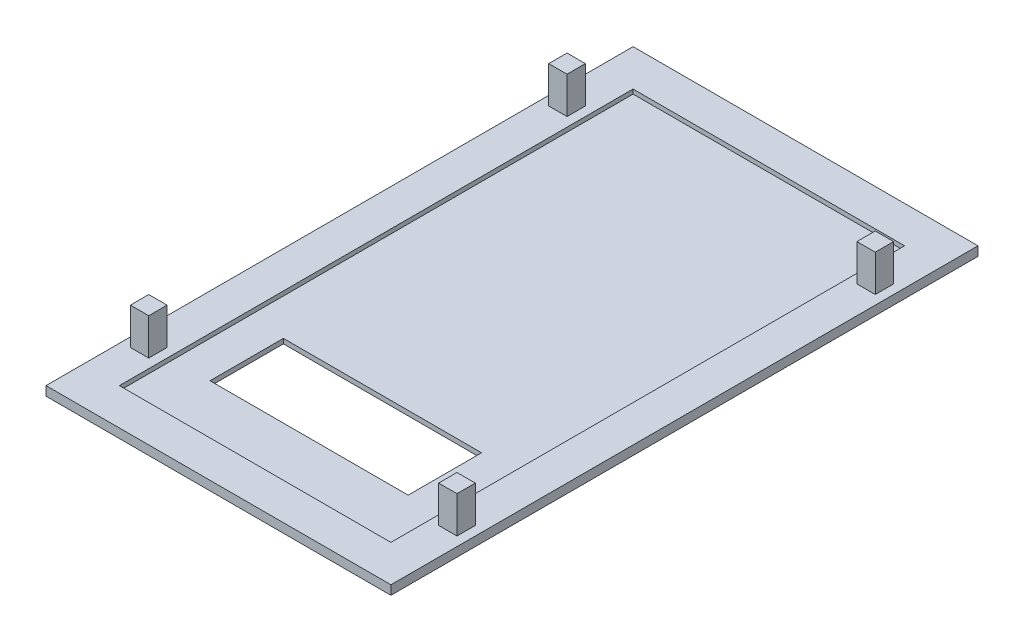
ISO-10303-21;
HEADER;
FILE_DESCRIPTION(('STEP AP214'),'2;1');
FILE_NAME('part.step','',(''),(''),'','','');
FILE_SCHEMA(('AUTOMOTIVE_DESIGN { 1 0 10303 214 1 1 1 1 }'));
ENDSEC;
DATA;
#1=APPLICATION_CONTEXT('core data for automotive mechanical design processes');
#2=APPLICATION_PROTOCOL_DEFINITION('international standard','automotive_design',2000,#1);
#3=PRODUCT_CONTEXT('',#1,'mechanical');
#4=PRODUCT('Part','Part','',(#3));
#5=PRODUCT_RELATED_PRODUCT_CATEGORY('part','',(#4));
#6=PRODUCT_DEFINITION_FORMATION('','',#4);
#7=PRODUCT_DEFINITION_CONTEXT('part definition',#1,'design');
#8=PRODUCT_DEFINITION('design','',#6,#7);
#9=PRODUCT_DEFINITION_SHAPE('','',#8);
#10=(LENGTH_UNIT() NAMED_UNIT(*) SI_UNIT(.MILLI.,.METRE.));
#11=(NAMED_UNIT(*) PLANE_ANGLE_UNIT() SI_UNIT($,.RADIAN.));
#12=(NAMED_UNIT(*) SI_UNIT($,.STERADIAN.) SOLID_ANGLE_UNIT());
#13=UNCERTAINTY_MEASURE_WITH_UNIT(LENGTH_MEASURE(1.E-05),#10,'distance_accuracy_value','');
#14=(GEOMETRIC_REPRESENTATION_CONTEXT(3) GLOBAL_UNCERTAINTY_ASSIGNED_CONTEXT((#13)) GLOBAL_UNIT_ASSIGNED_CONTEXT((#10,
#11,#12)) REPRESENTATION_CONTEXT('',''));
#15=CARTESIAN_POINT('',(0.,0.,0.));
#16=DIRECTION('',(0.,0.,1.));
#17=DIRECTION('',(1.,0.,0.));
#18=AXIS2_PLACEMENT_3D('',#15,#16,#17);
#19=CARTESIAN_POINT('',(10.,-3.75,-22.35));
#20=DIRECTION('',(-1.,0.,0.));
#21=DIRECTION('',(0.,0.,1.));
#22=AXIS2_PLACEMENT_3D('',#19,#20,#21);
#23=PLANE('',#22);
#24=DIRECTION('',(0.,0.,-1.));
#25=VECTOR('',#24,1.);
#26=CARTESIAN_POINT('',(10.,0.65,-22.35));
#27=LINE('',#26,#25);
#28=CARTESIAN_POINT('',(10.,0.65,-12.35));
#29=VERTEX_POINT('',#28);
#30=CARTESIAN_POINT('',(10.,0.65,-22.35));
#31=VERTEX_POINT('',#30);
#32=EDGE_CURVE('E258',#29,#31,#27,.T.);
#33=ORIENTED_EDGE('',*,*,#32,.F.);
#34=DIRECTION('',(0.,1.,0.));
#35=VECTOR('',#34,1.);
#36=CARTESIAN_POINT('',(10.,-3.75,-12.35));
#37=LINE('',#36,#35);
#38=CARTESIAN_POINT('',(10.,0.,-12.35));
#39=VERTEX_POINT('',#38);
#40=EDGE_CURVE('E260',#39,#29,#37,.T.);
#41=ORIENTED_EDGE('',*,*,#40,.F.);
#42=DIRECTION('',(0.,0.,-1.));
#43=VECTOR('',#42,1.);
#44=CARTESIAN_POINT('',(10.,0.,0.));
#45=LINE('',#44,#43);
#46=CARTESIAN_POINT('',(10.,0.,-22.35));
#47=VERTEX_POINT('',#46);
#48=EDGE_CURVE('E41',#39,#47,#45,.T.);
#49=ORIENTED_EDGE('',*,*,#48,.T.);
#50=DIRECTION('',(0.,1.,0.));
#51=VECTOR('',#50,1.);
#52=CARTESIAN_POINT('',(10.,-3.75,-22.35));
#53=LINE('',#52,#51);
#54=EDGE_CURVE('E261',#47,#31,#53,.T.);
#55=ORIENTED_EDGE('',*,*,#54,.T.);
#56=EDGE_LOOP('',(#33,#41,#49,#55));
#57=FACE_BOUND('',#56,.T.);
#58=ADVANCED_FACE('F33',(#57),#23,.F.);
#59=CARTESIAN_POINT('',(10.,-3.75,-22.35));
#60=DIRECTION('',(0.,0.,-1.));
#61=DIRECTION('',(-1.,0.,0.));
#62=AXIS2_PLACEMENT_3D('',#59,#60,#61);
#63=PLANE('',#62);
#64=DIRECTION('',(1.,0.,0.));
#65=VECTOR('',#64,1.);
#66=CARTESIAN_POINT('',(10.,0.65,-22.35));
#67=LINE('',#66,#65);
#68=CARTESIAN_POINT('',(37.,0.65,-22.35));
#69=VERTEX_POINT('',#68);
#70=EDGE_CURVE('E256',#31,#69,#67,.T.);
#71=ORIENTED_EDGE('',*,*,#70,.F.);
#72=ORIENTED_EDGE('',*,*,#54,.F.);
#73=DIRECTION('',(1.,0.,0.));
#74=VECTOR('',#73,1.);
#75=CARTESIAN_POINT('',(0.,0.,-22.35));
#76=LINE('',#75,#74);
#77=CARTESIAN_POINT('',(37.,0.,-22.35));
#78=VERTEX_POINT('',#77);
#79=EDGE_CURVE('E439',#47,#78,#76,.T.);
#80=ORIENTED_EDGE('',*,*,#79,.T.);
#81=DIRECTION('',(0.,1.,0.));
#82=VECTOR('',#81,1.);
#83=CARTESIAN_POINT('',(37.,-3.75,-22.35));
#84=LINE('',#83,#82);
#85=EDGE_CURVE('E265',#78,#69,#84,.T.);
#86=ORIENTED_EDGE('',*,*,#85,.T.);
#87=EDGE_LOOP('',(#71,#72,#80,#86));
#88=FACE_BOUND('',#87,.T.);
#89=ADVANCED_FACE('F450',(#88),#63,.F.);
#90=CARTESIAN_POINT('',(37.,-3.75,-22.35));
#91=DIRECTION('',(1.,0.,0.));
#92=DIRECTION('',(0.,0.,-1.));
#93=AXIS2_PLACEMENT_3D('',#90,#91,#92);
#94=PLANE('',#93);
#95=DIRECTION('',(0.,0.,1.));
#96=VECTOR('',#95,1.);
#97=CARTESIAN_POINT('',(37.,0.65,-22.35));
#98=LINE('',#97,#96);
#99=CARTESIAN_POINT('',(37.,0.65,-12.35));
#100=VERTEX_POINT('',#99);
#101=EDGE_CURVE('E55',#69,#100,#98,.T.);
#102=ORIENTED_EDGE('',*,*,#101,.F.);
#103=ORIENTED_EDGE('',*,*,#85,.F.);
#104=DIRECTION('',(0.,0.,1.));
#105=VECTOR('',#104,1.);
#106=CARTESIAN_POINT('',(37.,0.,0.));
#107=LINE('',#106,#105);
#108=CARTESIAN_POINT('',(37.,0.,-12.35));
#109=VERTEX_POINT('',#108);
#110=EDGE_CURVE('E436',#78,#109,#107,.T.);
#111=ORIENTED_EDGE('',*,*,#110,.T.);
#112=DIRECTION('',(0.,1.,0.));
#113=VECTOR('',#112,1.);
#114=CARTESIAN_POINT('',(37.,-3.75,-12.35));
#115=LINE('',#114,#113);
#116=EDGE_CURVE('E268',#109,#100,#115,.T.);
#117=ORIENTED_EDGE('',*,*,#116,.T.);
#118=EDGE_LOOP('',(#102,#103,#111,#117));
#119=FACE_BOUND('',#118,.T.);
#120=ADVANCED_FACE('F456',(#119),#94,.F.);
#121=CARTESIAN_POINT('',(10.,-3.75,-12.35));
#122=DIRECTION('',(0.,0.,1.));
#123=DIRECTION('',(1.,0.,0.));
#124=AXIS2_PLACEMENT_3D('',#121,#122,#123);
#125=PLANE('',#124);
#126=DIRECTION('',(-1.,0.,0.));
#127=VECTOR('',#126,1.);
#128=CARTESIAN_POINT('',(10.,0.65,-12.35));
#129=LINE('',#128,#127);
#130=EDGE_CURVE('E11',#100,#29,#129,.T.);
#131=ORIENTED_EDGE('',*,*,#130,.F.);
#132=ORIENTED_EDGE('',*,*,#116,.F.);
#133=DIRECTION('',(-1.,0.,0.));
#134=VECTOR('',#133,1.);
#135=CARTESIAN_POINT('',(0.,0.,-12.35));
#136=LINE('',#135,#134);
#137=EDGE_CURVE('E434',#109,#39,#136,.T.);
#138=ORIENTED_EDGE('',*,*,#137,.T.);
#139=ORIENTED_EDGE('',*,*,#40,.T.);
#140=EDGE_LOOP('',(#131,#132,#138,#139));
#141=FACE_BOUND('',#140,.T.);
#142=ADVANCED_FACE('F458',(#141),#125,.F.);
#143=CARTESIAN_POINT('',(0.,1.25,0.));
#144=DIRECTION('',(0.,-1.,0.));
#145=DIRECTION('',(0.,0.,-1.));
#146=AXIS2_PLACEMENT_3D('',#143,#144,#145);
#147=PLANE('',#146);
#148=DIRECTION('',(1.,0.,0.));
#149=VECTOR('',#148,1.);
#150=CARTESIAN_POINT('',(5.00000000000001,1.25,-5.));
#151=LINE('',#150,#149);
#152=CARTESIAN_POINT('',(5.00000000000001,1.25,-5.));
#153=VERTEX_POINT('',#152);
#154=CARTESIAN_POINT('',(42.,1.25,-5.));
#155=VERTEX_POINT('',#154);
#156=EDGE_CURVE('E246',#153,#155,#151,.T.);
#157=ORIENTED_EDGE('',*,*,#156,.F.);
#158=DIRECTION('',(0.,0.,1.));
#159=VECTOR('',#158,1.);
#160=CARTESIAN_POINT('',(5.,1.25,-75.));
#161=LINE('',#160,#159);
#162=CARTESIAN_POINT('',(5.,1.25,-75.));
#163=VERTEX_POINT('',#162);
#164=EDGE_CURVE('E48',#163,#153,#161,.T.);
#165=ORIENTED_EDGE('',*,*,#164,.F.);
#166=DIRECTION('',(-1.,0.,0.));
#167=VECTOR('',#166,1.);
#168=CARTESIAN_POINT('',(5.,1.25,-75.));
#169=LINE('',#168,#167);
#170=CARTESIAN_POINT('',(42.,1.25,-75.));
#171=VERTEX_POINT('',#170);
#172=EDGE_CURVE('E237',#171,#163,#169,.T.);
#173=ORIENTED_EDGE('',*,*,#172,.F.);
#174=DIRECTION('',(0.,0.,-1.));
#175=VECTOR('',#174,1.);
#176=CARTESIAN_POINT('',(42.,1.25,-75.));
#177=LINE('',#176,#175);
#178=EDGE_CURVE('E240',#155,#171,#177,.T.);
#179=ORIENTED_EDGE('',*,*,#178,.F.);
#180=EDGE_LOOP('',(#157,#165,#173,#179));
#181=FACE_BOUND('',#180,.T.);
#182=DIRECTION('',(0.,0.,1.));
#183=VECTOR('',#182,1.);
#184=CARTESIAN_POINT('',(1.24999999999999,1.25,-10.25));
#185=LINE('',#184,#183);
#186=CARTESIAN_POINT('',(1.25,1.25,-12.75));
#187=VERTEX_POINT('',#186);
#188=CARTESIAN_POINT('',(1.24999999999999,1.25,-10.25));
#189=VERTEX_POINT('',#188);
#190=EDGE_CURVE('E305',#187,#189,#185,.T.);
#191=ORIENTED_EDGE('',*,*,#190,.F.);
#192=DIRECTION('',(-1.,0.,0.));
#193=VECTOR('',#192,1.);
#194=CARTESIAN_POINT('',(1.25,1.25,-12.75));
#195=LINE('',#194,#193);
#196=CARTESIAN_POINT('',(3.75,1.25,-12.75));
#197=VERTEX_POINT('',#196);
#198=EDGE_CURVE('E310',#197,#187,#195,.T.);
#199=ORIENTED_EDGE('',*,*,#198,.F.);
#200=DIRECTION('',(0.,0.,-1.));
#201=VECTOR('',#200,1.);
#202=CARTESIAN_POINT('',(3.75,1.25,-10.25));
#203=LINE('',#202,#201);
#204=CARTESIAN_POINT('',(3.75,1.25,-10.25));
#205=VERTEX_POINT('',#204);
#206=EDGE_CURVE('E322',#205,#197,#203,.T.);
#207=ORIENTED_EDGE('',*,*,#206,.F.);
#208=DIRECTION('',(1.,0.,0.));
#209=VECTOR('',#208,1.);
#210=CARTESIAN_POINT('',(1.24999999999999,1.25,-10.25));
#211=LINE('',#210,#209);
#212=EDGE_CURVE('E319',#189,#205,#211,.T.);
#213=ORIENTED_EDGE('',*,*,#212,.F.);
#214=EDGE_LOOP('',(#191,#199,#207,#213));
#215=FACE_BOUND('',#214,.T.);
#216=DIRECTION('',(0.,0.,1.));
#217=VECTOR('',#216,1.);
#218=CARTESIAN_POINT('',(43.25,1.25,-69.75));
#219=LINE('',#218,#217);
#220=CARTESIAN_POINT('',(43.25,1.25,-69.75));
#221=VERTEX_POINT('',#220);
#222=CARTESIAN_POINT('',(43.25,1.25,-67.25));
#223=VERTEX_POINT('',#222);
#224=EDGE_CURVE('E371',#221,#223,#219,.T.);
#225=ORIENTED_EDGE('',*,*,#224,.F.);
#226=DIRECTION('',(-1.,0.,0.));
#227=VECTOR('',#226,1.);
#228=CARTESIAN_POINT('',(43.25,1.25,-69.75));
#229=LINE('',#228,#227);
#230=CARTESIAN_POINT('',(45.75,1.25,-69.75));
#231=VERTEX_POINT('',#230);
#232=EDGE_CURVE('E376',#231,#221,#229,.T.);
#233=ORIENTED_EDGE('',*,*,#232,.F.);
#234=DIRECTION('',(0.,0.,-1.));
#235=VECTOR('',#234,1.);
#236=CARTESIAN_POINT('',(45.75,1.25,-69.75));
#237=LINE('',#236,#235);
#238=CARTESIAN_POINT('',(45.75,1.25,-67.25));
#239=VERTEX_POINT('',#238);
#240=EDGE_CURVE('E388',#239,#231,#237,.T.);
#241=ORIENTED_EDGE('',*,*,#240,.F.);
#242=DIRECTION('',(1.,0.,0.));
#243=VECTOR('',#242,1.);
#244=CARTESIAN_POINT('',(43.25,1.25,-67.25));
#245=LINE('',#244,#243);
#246=EDGE_CURVE('E385',#223,#239,#245,.T.);
#247=ORIENTED_EDGE('',*,*,#246,.F.);
#248=EDGE_LOOP('',(#225,#233,#241,#247));
#249=FACE_BOUND('',#248,.T.);
#250=DIRECTION('',(0.,0.,1.));
#251=VECTOR('',#250,1.);
#252=CARTESIAN_POINT('',(0.,1.25,0.));
#253=LINE('',#252,#251);
#254=CARTESIAN_POINT('',(0.,1.25,-80.));
#255=VERTEX_POINT('',#254);
#256=CARTESIAN_POINT('',(0.,1.25,0.));
#257=VERTEX_POINT('',#256);
#258=EDGE_CURVE('E405',#255,#257,#253,.T.);
#259=ORIENTED_EDGE('',*,*,#258,.T.);
#260=DIRECTION('',(1.,0.,0.));
#261=VECTOR('',#260,1.);
#262=CARTESIAN_POINT('',(0.,1.25,0.));
#263=LINE('',#262,#261);
#264=CARTESIAN_POINT('',(47.,1.25,0.));
#265=VERTEX_POINT('',#264);
#266=EDGE_CURVE('E408',#257,#265,#263,.T.);
#267=ORIENTED_EDGE('',*,*,#266,.T.);
#268=DIRECTION('',(0.,0.,-1.));
#269=VECTOR('',#268,1.);
#270=CARTESIAN_POINT('',(47.,1.25,0.));
#271=LINE('',#270,#269);
#272=CARTESIAN_POINT('',(47.,1.25,-80.));
#273=VERTEX_POINT('',#272);
#274=EDGE_CURVE('E411',#265,#273,#271,.T.);
#275=ORIENTED_EDGE('',*,*,#274,.T.);
#276=DIRECTION('',(-1.,0.,0.));
#277=VECTOR('',#276,1.);
#278=CARTESIAN_POINT('',(0.,1.25,-80.));
#279=LINE('',#278,#277);
#280=EDGE_CURVE('E413',#273,#255,#279,.T.);
#281=ORIENTED_EDGE('',*,*,#280,.T.);
#282=EDGE_LOOP('',(#259,#267,#275,#281));
#283=FACE_BOUND('',#282,.T.);
#284=DIRECTION('',(0.,0.,-1.));
#285=VECTOR('',#284,1.);
#286=CARTESIAN_POINT('',(45.75,1.25,-12.75));
#287=LINE('',#286,#285);
#288=CARTESIAN_POINT('',(45.75,1.25,-10.25));
#289=VERTEX_POINT('',#288);
#290=CARTESIAN_POINT('',(45.75,1.25,-12.75));
#291=VERTEX_POINT('',#290);
#292=EDGE_CURVE('E338',#289,#291,#287,.T.);
#293=ORIENTED_EDGE('',*,*,#292,.F.);
#294=DIRECTION('',(1.,0.,0.));
#295=VECTOR('',#294,1.);
#296=CARTESIAN_POINT('',(45.75,1.25,-10.25));
#297=LINE('',#296,#295);
#298=CARTESIAN_POINT('',(43.25,1.25,-10.25));
#299=VERTEX_POINT('',#298);
#300=EDGE_CURVE('E343',#299,#289,#297,.T.);
#301=ORIENTED_EDGE('',*,*,#300,.F.);
#302=DIRECTION('',(0.,0.,1.));
#303=VECTOR('',#302,1.);
#304=CARTESIAN_POINT('',(43.25,1.25,-12.75));
#305=LINE('',#304,#303);
#306=CARTESIAN_POINT('',(43.25,1.25,-12.75));
#307=VERTEX_POINT('',#306);
#308=EDGE_CURVE('E355',#307,#299,#305,.T.);
#309=ORIENTED_EDGE('',*,*,#308,.F.);
#310=DIRECTION('',(-1.,0.,0.));
#311=VECTOR('',#310,1.);
#312=CARTESIAN_POINT('',(45.75,1.25,-12.75));
#313=LINE('',#312,#311);
#314=EDGE_CURVE('E352',#291,#307,#313,.T.);
#315=ORIENTED_EDGE('',*,*,#314,.F.);
#316=EDGE_LOOP('',(#293,#301,#309,#315));
#317=FACE_BOUND('',#316,.T.);
#318=DIRECTION('',(0.,0.,1.));
#319=VECTOR('',#318,1.);
#320=CARTESIAN_POINT('',(1.25,1.25,-69.75));
#321=LINE('',#320,#319);
#322=CARTESIAN_POINT('',(1.25,1.25,-69.75));
#323=VERTEX_POINT('',#322);
#324=CARTESIAN_POINT('',(1.25,1.25,-67.25));
#325=VERTEX_POINT('',#324);
#326=EDGE_CURVE('E264',#323,#325,#321,.T.);
#327=ORIENTED_EDGE('',*,*,#326,.F.);
#328=DIRECTION('',(-1.,0.,0.));
#329=VECTOR('',#328,1.);
#330=CARTESIAN_POINT('',(1.25,1.25,-69.75));
#331=LINE('',#330,#329);
#332=CARTESIAN_POINT('',(3.75,1.25,-69.75));
#333=VERTEX_POINT('',#332);
#334=EDGE_CURVE('E277',#333,#323,#331,.T.);
#335=ORIENTED_EDGE('',*,*,#334,.F.);
#336=DIRECTION('',(0.,0.,-1.));
#337=VECTOR('',#336,1.);
#338=CARTESIAN_POINT('',(3.75,1.25,-69.75));
#339=LINE('',#338,#337);
#340=CARTESIAN_POINT('',(3.75,1.25,-67.25));
#341=VERTEX_POINT('',#340);
#342=EDGE_CURVE('E289',#341,#333,#339,.T.);
#343=ORIENTED_EDGE('',*,*,#342,.F.);
#344=DIRECTION('',(1.,0.,0.));
#345=VECTOR('',#344,1.);
#346=CARTESIAN_POINT('',(1.25,1.25,-67.25));
#347=LINE('',#346,#345);
#348=EDGE_CURVE('E286',#325,#341,#347,.T.);
#349=ORIENTED_EDGE('',*,*,#348,.F.);
#350=EDGE_LOOP('',(#327,#335,#343,#349));
#351=FACE_BOUND('',#350,.T.);
#352=ADVANCED_FACE('F556',(#181,#215,#249,#283,#317,#351),#147,.F.);
#353=CARTESIAN_POINT('',(0.,1.25,0.));
#354=DIRECTION('',(1.,0.,0.));
#355=DIRECTION('',(0.,0.,-1.));
#356=AXIS2_PLACEMENT_3D('',#353,#354,#355);
#357=PLANE('',#356);
#358=DIRECTION('',(0.,0.,1.));
#359=VECTOR('',#358,1.);
#360=CARTESIAN_POINT('',(0.,0.,0.));
#361=LINE('',#360,#359);
#362=CARTESIAN_POINT('',(0.,0.,-80.));
#363=VERTEX_POINT('',#362);
#364=CARTESIAN_POINT('',(0.,0.,0.));
#365=VERTEX_POINT('',#364);
#366=EDGE_CURVE('E404',#363,#365,#361,.T.);
#367=ORIENTED_EDGE('',*,*,#366,.T.);
#368=DIRECTION('',(0.,-1.,0.));
#369=VECTOR('',#368,1.);
#370=CARTESIAN_POINT('',(0.,1.25,0.));
#371=LINE('',#370,#369);
#372=EDGE_CURVE('E431',#257,#365,#371,.T.);
#373=ORIENTED_EDGE('',*,*,#372,.F.);
#374=ORIENTED_EDGE('',*,*,#258,.F.);
#375=DIRECTION('',(0.,-1.,0.));
#376=VECTOR('',#375,1.);
#377=CARTESIAN_POINT('',(0.,1.25,-80.));
#378=LINE('',#377,#376);
#379=EDGE_CURVE('E415',#255,#363,#378,.T.);
#380=ORIENTED_EDGE('',*,*,#379,.T.);
#381=EDGE_LOOP('',(#367,#373,#374,#380));
#382=FACE_BOUND('',#381,.T.);
#383=ADVANCED_FACE('F35',(#382),#357,.F.);
#384=CARTESIAN_POINT('',(0.,1.25,0.));
#385=DIRECTION('',(0.,0.,-1.));
#386=DIRECTION('',(-1.,0.,0.));
#387=AXIS2_PLACEMENT_3D('',#384,#385,#386);
#388=PLANE('',#387);
#389=DIRECTION('',(1.,0.,0.));
#390=VECTOR('',#389,1.);
#391=CARTESIAN_POINT('',(0.,0.,0.));
#392=LINE('',#391,#390);
#393=CARTESIAN_POINT('',(47.,0.,0.));
#394=VERTEX_POINT('',#393);
#395=EDGE_CURVE('E418',#365,#394,#392,.T.);
#396=ORIENTED_EDGE('',*,*,#395,.T.);
#397=DIRECTION('',(0.,-1.,0.));
#398=VECTOR('',#397,1.);
#399=CARTESIAN_POINT('',(47.,1.25,0.));
#400=LINE('',#399,#398);
#401=EDGE_CURVE('E428',#265,#394,#400,.T.);
#402=ORIENTED_EDGE('',*,*,#401,.F.);
#403=ORIENTED_EDGE('',*,*,#266,.F.);
#404=ORIENTED_EDGE('',*,*,#372,.T.);
#405=EDGE_LOOP('',(#396,#402,#403,#404));
#406=FACE_BOUND('',#405,.T.);
#407=ADVANCED_FACE('F568',(#406),#388,.F.);
#408=CARTESIAN_POINT('',(47.,1.25,0.));
#409=DIRECTION('',(-1.,0.,0.));
#410=DIRECTION('',(0.,0.,1.));
#411=AXIS2_PLACEMENT_3D('',#408,#409,#410);
#412=PLANE('',#411);
#413=DIRECTION('',(0.,0.,-1.));
#414=VECTOR('',#413,1.);
#415=CARTESIAN_POINT('',(47.,0.,0.));
#416=LINE('',#415,#414);
#417=CARTESIAN_POINT('',(47.,0.,-80.));
#418=VERTEX_POINT('',#417);
#419=EDGE_CURVE('E420',#394,#418,#416,.T.);
#420=ORIENTED_EDGE('',*,*,#419,.T.);
#421=DIRECTION('',(0.,-1.,0.));
#422=VECTOR('',#421,1.);
#423=CARTESIAN_POINT('',(47.,1.25,-80.));
#424=LINE('',#423,#422);
#425=EDGE_CURVE('E425',#273,#418,#424,.T.);
#426=ORIENTED_EDGE('',*,*,#425,.F.);
#427=ORIENTED_EDGE('',*,*,#274,.F.);
#428=ORIENTED_EDGE('',*,*,#401,.T.);
#429=EDGE_LOOP('',(#420,#426,#427,#428));
#430=FACE_BOUND('',#429,.T.);
#431=ADVANCED_FACE('F565',(#430),#412,.F.);
#432=CARTESIAN_POINT('',(0.,1.25,-80.));
#433=DIRECTION('',(0.,0.,1.));
#434=DIRECTION('',(1.,0.,0.));
#435=AXIS2_PLACEMENT_3D('',#432,#433,#434);
#436=PLANE('',#435);
#437=DIRECTION('',(-1.,0.,0.));
#438=VECTOR('',#437,1.);
#439=CARTESIAN_POINT('',(0.,0.,-80.));
#440=LINE('',#439,#438);
#441=EDGE_CURVE('E409',#418,#363,#440,.T.);
#442=ORIENTED_EDGE('',*,*,#441,.T.);
#443=ORIENTED_EDGE('',*,*,#379,.F.);
#444=ORIENTED_EDGE('',*,*,#280,.F.);
#445=ORIENTED_EDGE('',*,*,#425,.T.);
#446=EDGE_LOOP('',(#442,#443,#444,#445));
#447=FACE_BOUND('',#446,.T.);
#448=ADVANCED_FACE('F562',(#447),#436,.F.);
#449=CARTESIAN_POINT('',(0.,0.,0.));
#450=DIRECTION('',(0.,-1.,0.));
#451=DIRECTION('',(0.,0.,-1.));
#452=AXIS2_PLACEMENT_3D('',#449,#450,#451);
#453=PLANE('',#452);
#454=ORIENTED_EDGE('',*,*,#48,.F.);
#455=ORIENTED_EDGE('',*,*,#137,.F.);
#456=ORIENTED_EDGE('',*,*,#110,.F.);
#457=ORIENTED_EDGE('',*,*,#79,.F.);
#458=EDGE_LOOP('',(#454,#455,#456,#457));
#459=FACE_BOUND('',#458,.T.);
#460=ORIENTED_EDGE('',*,*,#366,.F.);
#461=ORIENTED_EDGE('',*,*,#441,.F.);
#462=ORIENTED_EDGE('',*,*,#419,.F.);
#463=ORIENTED_EDGE('',*,*,#395,.F.);
#464=EDGE_LOOP('',(#460,#461,#462,#463));
#465=FACE_BOUND('',#464,.T.);
#466=ADVANCED_FACE('F453',(#459,#465),#453,.T.);
#467=CARTESIAN_POINT('',(43.25,6.25,-69.75));
#468=DIRECTION('',(1.,0.,0.));
#469=DIRECTION('',(0.,0.,-1.));
#470=AXIS2_PLACEMENT_3D('',#467,#468,#469);
#471=PLANE('',#470);
#472=ORIENTED_EDGE('',*,*,#224,.T.);
#473=DIRECTION('',(0.,-1.,0.));
#474=VECTOR('',#473,1.);
#475=CARTESIAN_POINT('',(43.25,6.25,-67.25));
#476=LINE('',#475,#474);
#477=CARTESIAN_POINT('',(43.25,6.25,-67.25));
#478=VERTEX_POINT('',#477);
#479=EDGE_CURVE('E401',#478,#223,#476,.T.);
#480=ORIENTED_EDGE('',*,*,#479,.F.);
#481=DIRECTION('',(0.,0.,1.));
#482=VECTOR('',#481,1.);
#483=CARTESIAN_POINT('',(43.25,6.25,-69.75));
#484=LINE('',#483,#482);
#485=CARTESIAN_POINT('',(43.25,6.25,-69.75));
#486=VERTEX_POINT('',#485);
#487=EDGE_CURVE('E372',#486,#478,#484,.T.);
#488=ORIENTED_EDGE('',*,*,#487,.F.);
#489=DIRECTION('',(0.,-1.,0.));
#490=VECTOR('',#489,1.);
#491=CARTESIAN_POINT('',(43.25,6.25,-69.75));
#492=LINE('',#491,#490);
#493=EDGE_CURVE('E382',#486,#221,#492,.T.);
#494=ORIENTED_EDGE('',*,*,#493,.T.);
#495=EDGE_LOOP('',(#472,#480,#488,#494));
#496=FACE_BOUND('',#495,.T.);
#497=ADVANCED_FACE('F551',(#496),#471,.F.);
#498=CARTESIAN_POINT('',(43.25,6.25,-67.25));
#499=DIRECTION('',(0.,0.,-1.));
#500=DIRECTION('',(-1.,0.,0.));
#501=AXIS2_PLACEMENT_3D('',#498,#499,#500);
#502=PLANE('',#501);
#503=ORIENTED_EDGE('',*,*,#246,.T.);
#504=DIRECTION('',(0.,-1.,0.));
#505=VECTOR('',#504,1.);
#506=CARTESIAN_POINT('',(45.75,6.25,-67.25));
#507=LINE('',#506,#505);
#508=CARTESIAN_POINT('',(45.75,6.25,-67.25));
#509=VERTEX_POINT('',#508);
#510=EDGE_CURVE('E398',#509,#239,#507,.T.);
#511=ORIENTED_EDGE('',*,*,#510,.F.);
#512=DIRECTION('',(1.,0.,0.));
#513=VECTOR('',#512,1.);
#514=CARTESIAN_POINT('',(43.25,6.25,-67.25));
#515=LINE('',#514,#513);
#516=EDGE_CURVE('E375',#478,#509,#515,.T.);
#517=ORIENTED_EDGE('',*,*,#516,.F.);
#518=ORIENTED_EDGE('',*,*,#479,.T.);
#519=EDGE_LOOP('',(#503,#511,#517,#518));
#520=FACE_BOUND('',#519,.T.);
#521=ADVANCED_FACE('F547',(#520),#502,.F.);
#522=CARTESIAN_POINT('',(45.75,6.25,-69.75));
#523=DIRECTION('',(-1.,0.,0.));
#524=DIRECTION('',(0.,0.,1.));
#525=AXIS2_PLACEMENT_3D('',#522,#523,#524);
#526=PLANE('',#525);
#527=ORIENTED_EDGE('',*,*,#240,.T.);
#528=DIRECTION('',(0.,-1.,0.));
#529=VECTOR('',#528,1.);
#530=CARTESIAN_POINT('',(45.75,6.25,-69.75));
#531=LINE('',#530,#529);
#532=CARTESIAN_POINT('',(45.75,6.25,-69.75));
#533=VERTEX_POINT('',#532);
#534=EDGE_CURVE('E395',#533,#231,#531,.T.);
#535=ORIENTED_EDGE('',*,*,#534,.F.);
#536=DIRECTION('',(0.,0.,-1.));
#537=VECTOR('',#536,1.);
#538=CARTESIAN_POINT('',(45.75,6.25,-69.75));
#539=LINE('',#538,#537);
#540=EDGE_CURVE('E378',#509,#533,#539,.T.);
#541=ORIENTED_EDGE('',*,*,#540,.F.);
#542=ORIENTED_EDGE('',*,*,#510,.T.);
#543=EDGE_LOOP('',(#527,#535,#541,#542));
#544=FACE_BOUND('',#543,.T.);
#545=ADVANCED_FACE('F543',(#544),#526,.F.);
#546=CARTESIAN_POINT('',(43.25,6.25,-69.75));
#547=DIRECTION('',(0.,0.,1.));
#548=DIRECTION('',(1.,0.,0.));
#549=AXIS2_PLACEMENT_3D('',#546,#547,#548);
#550=PLANE('',#549);
#551=ORIENTED_EDGE('',*,*,#232,.T.);
#552=ORIENTED_EDGE('',*,*,#493,.F.);
#553=DIRECTION('',(-1.,0.,0.));
#554=VECTOR('',#553,1.);
#555=CARTESIAN_POINT('',(43.25,6.25,-69.75));
#556=LINE('',#555,#554);
#557=EDGE_CURVE('E380',#533,#486,#556,.T.);
#558=ORIENTED_EDGE('',*,*,#557,.F.);
#559=ORIENTED_EDGE('',*,*,#534,.T.);
#560=EDGE_LOOP('',(#551,#552,#558,#559));
#561=FACE_BOUND('',#560,.T.);
#562=ADVANCED_FACE('F539',(#561),#550,.F.);
#563=CARTESIAN_POINT('',(0.,6.25,0.));
#564=DIRECTION('',(0.,1.,0.));
#565=DIRECTION('',(0.,0.,1.));
#566=AXIS2_PLACEMENT_3D('',#563,#564,#565);
#567=PLANE('',#566);
#568=ORIENTED_EDGE('',*,*,#487,.T.);
#569=ORIENTED_EDGE('',*,*,#516,.T.);
#570=ORIENTED_EDGE('',*,*,#540,.T.);
#571=ORIENTED_EDGE('',*,*,#557,.T.);
#572=EDGE_LOOP('',(#568,#569,#570,#571));
#573=FACE_BOUND('',#572,.T.);
#574=ADVANCED_FACE('F535',(#573),#567,.T.);
#575=CARTESIAN_POINT('',(45.75,6.25,-12.75));
#576=DIRECTION('',(-1.,0.,0.));
#577=DIRECTION('',(0.,0.,1.));
#578=AXIS2_PLACEMENT_3D('',#575,#576,#577);
#579=PLANE('',#578);
#580=ORIENTED_EDGE('',*,*,#292,.T.);
#581=DIRECTION('',(0.,-1.,0.));
#582=VECTOR('',#581,1.);
#583=CARTESIAN_POINT('',(45.75,6.25,-12.75));
#584=LINE('',#583,#582);
#585=CARTESIAN_POINT('',(45.75,6.25,-12.75));
#586=VERTEX_POINT('',#585);
#587=EDGE_CURVE('E368',#586,#291,#584,.T.);
#588=ORIENTED_EDGE('',*,*,#587,.F.);
#589=DIRECTION('',(0.,0.,-1.));
#590=VECTOR('',#589,1.);
#591=CARTESIAN_POINT('',(45.75,6.25,-12.75));
#592=LINE('',#591,#590);
#593=CARTESIAN_POINT('',(45.75,6.25,-10.25));
#594=VERTEX_POINT('',#593);
#595=EDGE_CURVE('E339',#594,#586,#592,.T.);
#596=ORIENTED_EDGE('',*,*,#595,.F.);
#597=DIRECTION('',(0.,-1.,0.));
#598=VECTOR('',#597,1.);
#599=CARTESIAN_POINT('',(45.75,6.25,-10.25));
#600=LINE('',#599,#598);
#601=EDGE_CURVE('E349',#594,#289,#600,.T.);
#602=ORIENTED_EDGE('',*,*,#601,.T.);
#603=EDGE_LOOP('',(#580,#588,#596,#602));
#604=FACE_BOUND('',#603,.T.);
#605=ADVANCED_FACE('F531',(#604),#579,.F.);
#606=CARTESIAN_POINT('',(45.75,6.25,-12.75));
#607=DIRECTION('',(0.,0.,1.));
#608=DIRECTION('',(1.,0.,0.));
#609=AXIS2_PLACEMENT_3D('',#606,#607,#608);
#610=PLANE('',#609);
#611=ORIENTED_EDGE('',*,*,#314,.T.);
#612=DIRECTION('',(0.,-1.,0.));
#613=VECTOR('',#612,1.);
#614=CARTESIAN_POINT('',(43.25,6.25,-12.75));
#615=LINE('',#614,#613);
#616=CARTESIAN_POINT('',(43.25,6.25,-12.75));
#617=VERTEX_POINT('',#616);
#618=EDGE_CURVE('E365',#617,#307,#615,.T.);
#619=ORIENTED_EDGE('',*,*,#618,.F.);
#620=DIRECTION('',(-1.,0.,0.));
#621=VECTOR('',#620,1.);
#622=CARTESIAN_POINT('',(45.75,6.25,-12.75));
#623=LINE('',#622,#621);
#624=EDGE_CURVE('E342',#586,#617,#623,.T.);
#625=ORIENTED_EDGE('',*,*,#624,.F.);
#626=ORIENTED_EDGE('',*,*,#587,.T.);
#627=EDGE_LOOP('',(#611,#619,#625,#626));
#628=FACE_BOUND('',#627,.T.);
#629=ADVANCED_FACE('F527',(#628),#610,.F.);
#630=CARTESIAN_POINT('',(43.25,6.25,-12.75));
#631=DIRECTION('',(1.,0.,0.));
#632=DIRECTION('',(0.,0.,-1.));
#633=AXIS2_PLACEMENT_3D('',#630,#631,#632);
#634=PLANE('',#633);
#635=ORIENTED_EDGE('',*,*,#308,.T.);
#636=DIRECTION('',(0.,-1.,0.));
#637=VECTOR('',#636,1.);
#638=CARTESIAN_POINT('',(43.25,6.25,-10.25));
#639=LINE('',#638,#637);
#640=CARTESIAN_POINT('',(43.25,6.25,-10.25));
#641=VERTEX_POINT('',#640);
#642=EDGE_CURVE('E362',#641,#299,#639,.T.);
#643=ORIENTED_EDGE('',*,*,#642,.F.);
#644=DIRECTION('',(0.,0.,1.));
#645=VECTOR('',#644,1.);
#646=CARTESIAN_POINT('',(43.25,6.25,-12.75));
#647=LINE('',#646,#645);
#648=EDGE_CURVE('E345',#617,#641,#647,.T.);
#649=ORIENTED_EDGE('',*,*,#648,.F.);
#650=ORIENTED_EDGE('',*,*,#618,.T.);
#651=EDGE_LOOP('',(#635,#643,#649,#650));
#652=FACE_BOUND('',#651,.T.);
#653=ADVANCED_FACE('F523',(#652),#634,.F.);
#654=CARTESIAN_POINT('',(45.75,6.25,-10.25));
#655=DIRECTION('',(0.,0.,-1.));
#656=DIRECTION('',(-1.,0.,0.));
#657=AXIS2_PLACEMENT_3D('',#654,#655,#656);
#658=PLANE('',#657);
#659=ORIENTED_EDGE('',*,*,#300,.T.);
#660=ORIENTED_EDGE('',*,*,#601,.F.);
#661=DIRECTION('',(1.,0.,0.));
#662=VECTOR('',#661,1.);
#663=CARTESIAN_POINT('',(45.75,6.25,-10.25));
#664=LINE('',#663,#662);
#665=EDGE_CURVE('E347',#641,#594,#664,.T.);
#666=ORIENTED_EDGE('',*,*,#665,.F.);
#667=ORIENTED_EDGE('',*,*,#642,.T.);
#668=EDGE_LOOP('',(#659,#660,#666,#667));
#669=FACE_BOUND('',#668,.T.);
#670=ADVANCED_FACE('F519',(#669),#658,.F.);
#671=CARTESIAN_POINT('',(0.,6.25,0.));
#672=DIRECTION('',(0.,-1.,0.));
#673=DIRECTION('',(0.,0.,-1.));
#674=AXIS2_PLACEMENT_3D('',#671,#672,#673);
#675=PLANE('',#674);
#676=ORIENTED_EDGE('',*,*,#595,.T.);
#677=ORIENTED_EDGE('',*,*,#624,.T.);
#678=ORIENTED_EDGE('',*,*,#648,.T.);
#679=ORIENTED_EDGE('',*,*,#665,.T.);
#680=EDGE_LOOP('',(#676,#677,#678,#679));
#681=FACE_BOUND('',#680,.T.);
#682=ADVANCED_FACE('F515',(#681),#675,.F.);
#683=CARTESIAN_POINT('',(1.24999999999999,6.25,-10.25));
#684=DIRECTION('',(1.,0.,0.));
#685=DIRECTION('',(0.,0.,-1.));
#686=AXIS2_PLACEMENT_3D('',#683,#684,#685);
#687=PLANE('',#686);
#688=ORIENTED_EDGE('',*,*,#190,.T.);
#689=DIRECTION('',(0.,-1.,0.));
#690=VECTOR('',#689,1.);
#691=CARTESIAN_POINT('',(1.24999999999999,6.25,-10.25));
#692=LINE('',#691,#690);
#693=CARTESIAN_POINT('',(1.24999999999999,6.25,-10.25));
#694=VERTEX_POINT('',#693);
#695=EDGE_CURVE('E335',#694,#189,#692,.T.);
#696=ORIENTED_EDGE('',*,*,#695,.F.);
#697=DIRECTION('',(0.,0.,1.));
#698=VECTOR('',#697,1.);
#699=CARTESIAN_POINT('',(1.24999999999999,6.25,-10.25));
#700=LINE('',#699,#698);
#701=CARTESIAN_POINT('',(1.25,6.25,-12.75));
#702=VERTEX_POINT('',#701);
#703=EDGE_CURVE('E306',#702,#694,#700,.T.);
#704=ORIENTED_EDGE('',*,*,#703,.F.);
#705=DIRECTION('',(0.,-1.,0.));
#706=VECTOR('',#705,1.);
#707=CARTESIAN_POINT('',(1.25,6.25,-12.75));
#708=LINE('',#707,#706);
#709=EDGE_CURVE('E316',#702,#187,#708,.T.);
#710=ORIENTED_EDGE('',*,*,#709,.T.);
#711=EDGE_LOOP('',(#688,#696,#704,#710));
#712=FACE_BOUND('',#711,.T.);
#713=ADVANCED_FACE('F511',(#712),#687,.F.);
#714=CARTESIAN_POINT('',(1.24999999999999,6.25,-10.25));
#715=DIRECTION('',(0.,0.,-1.));
#716=DIRECTION('',(-1.,0.,0.));
#717=AXIS2_PLACEMENT_3D('',#714,#715,#716);
#718=PLANE('',#717);
#719=ORIENTED_EDGE('',*,*,#212,.T.);
#720=DIRECTION('',(0.,-1.,0.));
#721=VECTOR('',#720,1.);
#722=CARTESIAN_POINT('',(3.75,6.25,-10.25));
#723=LINE('',#722,#721);
#724=CARTESIAN_POINT('',(3.75,6.25,-10.25));
#725=VERTEX_POINT('',#724);
#726=EDGE_CURVE('E332',#725,#205,#723,.T.);
#727=ORIENTED_EDGE('',*,*,#726,.F.);
#728=DIRECTION('',(1.,0.,0.));
#729=VECTOR('',#728,1.);
#730=CARTESIAN_POINT('',(1.24999999999999,6.25,-10.25));
#731=LINE('',#730,#729);
#732=EDGE_CURVE('E309',#694,#725,#731,.T.);
#733=ORIENTED_EDGE('',*,*,#732,.F.);
#734=ORIENTED_EDGE('',*,*,#695,.T.);
#735=EDGE_LOOP('',(#719,#727,#733,#734));
#736=FACE_BOUND('',#735,.T.);
#737=ADVANCED_FACE('F507',(#736),#718,.F.);
#738=CARTESIAN_POINT('',(3.75,6.25,-10.25));
#739=DIRECTION('',(-1.,0.,0.));
#740=DIRECTION('',(0.,0.,1.));
#741=AXIS2_PLACEMENT_3D('',#738,#739,#740);
#742=PLANE('',#741);
#743=ORIENTED_EDGE('',*,*,#206,.T.);
#744=DIRECTION('',(0.,-1.,0.));
#745=VECTOR('',#744,1.);
#746=CARTESIAN_POINT('',(3.75,6.25,-12.75));
#747=LINE('',#746,#745);
#748=CARTESIAN_POINT('',(3.75,6.25,-12.75));
#749=VERTEX_POINT('',#748);
#750=EDGE_CURVE('E329',#749,#197,#747,.T.);
#751=ORIENTED_EDGE('',*,*,#750,.F.);
#752=DIRECTION('',(0.,0.,-1.));
#753=VECTOR('',#752,1.);
#754=CARTESIAN_POINT('',(3.75,6.25,-10.25));
#755=LINE('',#754,#753);
#756=EDGE_CURVE('E312',#725,#749,#755,.T.);
#757=ORIENTED_EDGE('',*,*,#756,.F.);
#758=ORIENTED_EDGE('',*,*,#726,.T.);
#759=EDGE_LOOP('',(#743,#751,#757,#758));
#760=FACE_BOUND('',#759,.T.);
#761=ADVANCED_FACE('F503',(#760),#742,.F.);
#762=CARTESIAN_POINT('',(1.25,6.25,-12.75));
#763=DIRECTION('',(0.,0.,1.));
#764=DIRECTION('',(1.,0.,0.));
#765=AXIS2_PLACEMENT_3D('',#762,#763,#764);
#766=PLANE('',#765);
#767=ORIENTED_EDGE('',*,*,#198,.T.);
#768=ORIENTED_EDGE('',*,*,#709,.F.);
#769=DIRECTION('',(-1.,0.,0.));
#770=VECTOR('',#769,1.);
#771=CARTESIAN_POINT('',(1.25,6.25,-12.75));
#772=LINE('',#771,#770);
#773=EDGE_CURVE('E314',#749,#702,#772,.T.);
#774=ORIENTED_EDGE('',*,*,#773,.F.);
#775=ORIENTED_EDGE('',*,*,#750,.T.);
#776=EDGE_LOOP('',(#767,#768,#774,#775));
#777=FACE_BOUND('',#776,.T.);
#778=ADVANCED_FACE('F499',(#777),#766,.F.);
#779=CARTESIAN_POINT('',(0.,6.25,0.));
#780=DIRECTION('',(0.,-1.,0.));
#781=DIRECTION('',(0.,0.,-1.));
#782=AXIS2_PLACEMENT_3D('',#779,#780,#781);
#783=PLANE('',#782);
#784=ORIENTED_EDGE('',*,*,#703,.T.);
#785=ORIENTED_EDGE('',*,*,#732,.T.);
#786=ORIENTED_EDGE('',*,*,#756,.T.);
#787=ORIENTED_EDGE('',*,*,#773,.T.);
#788=EDGE_LOOP('',(#784,#785,#786,#787));
#789=FACE_BOUND('',#788,.T.);
#790=ADVANCED_FACE('F495',(#789),#783,.F.);
#791=CARTESIAN_POINT('',(1.25,6.25,-69.75));
#792=DIRECTION('',(1.,0.,0.));
#793=DIRECTION('',(0.,0.,-1.));
#794=AXIS2_PLACEMENT_3D('',#791,#792,#793);
#795=PLANE('',#794);
#796=ORIENTED_EDGE('',*,*,#326,.T.);
#797=DIRECTION('',(0.,-1.,0.));
#798=VECTOR('',#797,1.);
#799=CARTESIAN_POINT('',(1.25,6.25,-67.25));
#800=LINE('',#799,#798);
#801=CARTESIAN_POINT('',(1.25,6.25,-67.25));
#802=VERTEX_POINT('',#801);
#803=EDGE_CURVE('E302',#802,#325,#800,.T.);
#804=ORIENTED_EDGE('',*,*,#803,.F.);
#805=DIRECTION('',(0.,0.,1.));
#806=VECTOR('',#805,1.);
#807=CARTESIAN_POINT('',(1.25,6.25,-69.75));
#808=LINE('',#807,#806);
#809=CARTESIAN_POINT('',(1.25,6.25,-69.75));
#810=VERTEX_POINT('',#809);
#811=EDGE_CURVE('E273',#810,#802,#808,.T.);
#812=ORIENTED_EDGE('',*,*,#811,.F.);
#813=DIRECTION('',(0.,-1.,0.));
#814=VECTOR('',#813,1.);
#815=CARTESIAN_POINT('',(1.25,6.25,-69.75));
#816=LINE('',#815,#814);
#817=EDGE_CURVE('E283',#810,#323,#816,.T.);
#818=ORIENTED_EDGE('',*,*,#817,.T.);
#819=EDGE_LOOP('',(#796,#804,#812,#818));
#820=FACE_BOUND('',#819,.T.);
#821=ADVANCED_FACE('F491',(#820),#795,.F.);
#822=CARTESIAN_POINT('',(1.25,6.25,-67.25));
#823=DIRECTION('',(0.,0.,-1.));
#824=DIRECTION('',(-1.,0.,0.));
#825=AXIS2_PLACEMENT_3D('',#822,#823,#824);
#826=PLANE('',#825);
#827=ORIENTED_EDGE('',*,*,#348,.T.);
#828=DIRECTION('',(0.,-1.,0.));
#829=VECTOR('',#828,1.);
#830=CARTESIAN_POINT('',(3.75,6.25,-67.25));
#831=LINE('',#830,#829);
#832=CARTESIAN_POINT('',(3.75,6.25,-67.25));
#833=VERTEX_POINT('',#832);
#834=EDGE_CURVE('E299',#833,#341,#831,.T.);
#835=ORIENTED_EDGE('',*,*,#834,.F.);
#836=DIRECTION('',(1.,0.,0.));
#837=VECTOR('',#836,1.);
#838=CARTESIAN_POINT('',(1.25,6.25,-67.25));
#839=LINE('',#838,#837);
#840=EDGE_CURVE('E276',#802,#833,#839,.T.);
#841=ORIENTED_EDGE('',*,*,#840,.F.);
#842=ORIENTED_EDGE('',*,*,#803,.T.);
#843=EDGE_LOOP('',(#827,#835,#841,#842));
#844=FACE_BOUND('',#843,.T.);
#845=ADVANCED_FACE('F487',(#844),#826,.F.);
#846=CARTESIAN_POINT('',(3.75,6.25,-69.75));
#847=DIRECTION('',(-1.,0.,0.));
#848=DIRECTION('',(0.,0.,1.));
#849=AXIS2_PLACEMENT_3D('',#846,#847,#848);
#850=PLANE('',#849);
#851=ORIENTED_EDGE('',*,*,#342,.T.);
#852=DIRECTION('',(0.,-1.,0.));
#853=VECTOR('',#852,1.);
#854=CARTESIAN_POINT('',(3.75,6.25,-69.75));
#855=LINE('',#854,#853);
#856=CARTESIAN_POINT('',(3.75,6.25,-69.75));
#857=VERTEX_POINT('',#856);
#858=EDGE_CURVE('E296',#857,#333,#855,.T.);
#859=ORIENTED_EDGE('',*,*,#858,.F.);
#860=DIRECTION('',(0.,0.,-1.));
#861=VECTOR('',#860,1.);
#862=CARTESIAN_POINT('',(3.75,6.25,-69.75));
#863=LINE('',#862,#861);
#864=EDGE_CURVE('E279',#833,#857,#863,.T.);
#865=ORIENTED_EDGE('',*,*,#864,.F.);
#866=ORIENTED_EDGE('',*,*,#834,.T.);
#867=EDGE_LOOP('',(#851,#859,#865,#866));
#868=FACE_BOUND('',#867,.T.);
#869=ADVANCED_FACE('F483',(#868),#850,.F.);
#870=CARTESIAN_POINT('',(1.25,6.25,-69.75));
#871=DIRECTION('',(0.,0.,1.));
#872=DIRECTION('',(1.,0.,0.));
#873=AXIS2_PLACEMENT_3D('',#870,#871,#872);
#874=PLANE('',#873);
#875=ORIENTED_EDGE('',*,*,#334,.T.);
#876=ORIENTED_EDGE('',*,*,#817,.F.);
#877=DIRECTION('',(-1.,0.,0.));
#878=VECTOR('',#877,1.);
#879=CARTESIAN_POINT('',(1.25,6.25,-69.75));
#880=LINE('',#879,#878);
#881=EDGE_CURVE('E281',#857,#810,#880,.T.);
#882=ORIENTED_EDGE('',*,*,#881,.F.);
#883=ORIENTED_EDGE('',*,*,#858,.T.);
#884=EDGE_LOOP('',(#875,#876,#882,#883));
#885=FACE_BOUND('',#884,.T.);
#886=ADVANCED_FACE('F468',(#885),#874,.F.);
#887=CARTESIAN_POINT('',(0.,6.25,0.));
#888=DIRECTION('',(0.,1.,0.));
#889=DIRECTION('',(0.,0.,1.));
#890=AXIS2_PLACEMENT_3D('',#887,#888,#889);
#891=PLANE('',#890);
#892=ORIENTED_EDGE('',*,*,#811,.T.);
#893=ORIENTED_EDGE('',*,*,#840,.T.);
#894=ORIENTED_EDGE('',*,*,#864,.T.);
#895=ORIENTED_EDGE('',*,*,#881,.T.);
#896=EDGE_LOOP('',(#892,#893,#894,#895));
#897=FACE_BOUND('',#896,.T.);
#898=ADVANCED_FACE('F460',(#897),#891,.T.);
#899=CARTESIAN_POINT('',(0.,0.65,0.));
#900=DIRECTION('',(0.,1.,0.));
#901=DIRECTION('',(0.,0.,1.));
#902=AXIS2_PLACEMENT_3D('',#899,#900,#901);
#903=PLANE('',#902);
#904=DIRECTION('',(0.,0.,1.));
#905=VECTOR('',#904,1.);
#906=CARTESIAN_POINT('',(5.,0.65,-75.));
#907=LINE('',#906,#905);
#908=CARTESIAN_POINT('',(5.,0.65,-75.));
#909=VERTEX_POINT('',#908);
#910=CARTESIAN_POINT('',(5.00000000000001,0.65,-5.));
#911=VERTEX_POINT('',#910);
#912=EDGE_CURVE('E219',#909,#911,#907,.T.);
#913=ORIENTED_EDGE('',*,*,#912,.T.);
#914=DIRECTION('',(1.,0.,0.));
#915=VECTOR('',#914,1.);
#916=CARTESIAN_POINT('',(5.00000000000001,0.65,-5.));
#917=LINE('',#916,#915);
#918=CARTESIAN_POINT('',(42.,0.65,-5.));
#919=VERTEX_POINT('',#918);
#920=EDGE_CURVE('E228',#911,#919,#917,.T.);
#921=ORIENTED_EDGE('',*,*,#920,.T.);
#922=DIRECTION('',(0.,0.,-1.));
#923=VECTOR('',#922,1.);
#924=CARTESIAN_POINT('',(42.,0.65,-75.));
#925=LINE('',#924,#923);
#926=CARTESIAN_POINT('',(42.,0.65,-75.));
#927=VERTEX_POINT('',#926);
#928=EDGE_CURVE('E233',#919,#927,#925,.T.);
#929=ORIENTED_EDGE('',*,*,#928,.T.);
#930=DIRECTION('',(-1.,0.,0.));
#931=VECTOR('',#930,1.);
#932=CARTESIAN_POINT('',(5.,0.65,-75.));
#933=LINE('',#932,#931);
#934=EDGE_CURVE('E225',#927,#909,#933,.T.);
#935=ORIENTED_EDGE('',*,*,#934,.T.);
#936=EDGE_LOOP('',(#913,#921,#929,#935));
#937=FACE_BOUND('',#936,.T.);
#938=ORIENTED_EDGE('',*,*,#32,.T.);
#939=ORIENTED_EDGE('',*,*,#70,.T.);
#940=ORIENTED_EDGE('',*,*,#101,.T.);
#941=ORIENTED_EDGE('',*,*,#130,.T.);
#942=EDGE_LOOP('',(#938,#939,#940,#941));
#943=FACE_BOUND('',#942,.T.);
#944=ADVANCED_FACE('F235',(#937,#943),#903,.T.);
#945=CARTESIAN_POINT('',(5.,0.65,-75.));
#946=DIRECTION('',(-1.,0.,0.));
#947=DIRECTION('',(0.,0.,1.));
#948=AXIS2_PLACEMENT_3D('',#945,#946,#947);
#949=PLANE('',#948);
#950=ORIENTED_EDGE('',*,*,#164,.T.);
#951=DIRECTION('',(0.,1.,0.));
#952=VECTOR('',#951,1.);
#953=CARTESIAN_POINT('',(5.00000000000001,0.65,-5.));
#954=LINE('',#953,#952);
#955=EDGE_CURVE('E215',#911,#153,#954,.T.);
#956=ORIENTED_EDGE('',*,*,#955,.F.);
#957=ORIENTED_EDGE('',*,*,#912,.F.);
#958=DIRECTION('',(0.,1.,0.));
#959=VECTOR('',#958,1.);
#960=CARTESIAN_POINT('',(5.,0.65,-75.));
#961=LINE('',#960,#959);
#962=EDGE_CURVE('E250',#909,#163,#961,.T.);
#963=ORIENTED_EDGE('',*,*,#962,.T.);
#964=EDGE_LOOP('',(#950,#956,#957,#963));
#965=FACE_BOUND('',#964,.T.);
#966=ADVANCED_FACE('F217',(#965),#949,.F.);
#967=CARTESIAN_POINT('',(5.,0.65,-75.));
#968=DIRECTION('',(0.,0.,-1.));
#969=DIRECTION('',(-1.,0.,0.));
#970=AXIS2_PLACEMENT_3D('',#967,#968,#969);
#971=PLANE('',#970);
#972=ORIENTED_EDGE('',*,*,#172,.T.);
#973=ORIENTED_EDGE('',*,*,#962,.F.);
#974=ORIENTED_EDGE('',*,*,#934,.F.);
#975=DIRECTION('',(0.,1.,0.));
#976=VECTOR('',#975,1.);
#977=CARTESIAN_POINT('',(42.,0.65,-75.));
#978=LINE('',#977,#976);
#979=EDGE_CURVE('E252',#927,#171,#978,.T.);
#980=ORIENTED_EDGE('',*,*,#979,.T.);
#981=EDGE_LOOP('',(#972,#973,#974,#980));
#982=FACE_BOUND('',#981,.T.);
#983=ADVANCED_FACE('F466',(#982),#971,.F.);
#984=CARTESIAN_POINT('',(42.,0.65,-75.));
#985=DIRECTION('',(1.,0.,0.));
#986=DIRECTION('',(0.,0.,-1.));
#987=AXIS2_PLACEMENT_3D('',#984,#985,#986);
#988=PLANE('',#987);
#989=ORIENTED_EDGE('',*,*,#178,.T.);
#990=ORIENTED_EDGE('',*,*,#979,.F.);
#991=ORIENTED_EDGE('',*,*,#928,.F.);
#992=DIRECTION('',(0.,1.,0.));
#993=VECTOR('',#992,1.);
#994=CARTESIAN_POINT('',(42.,0.65,-5.));
#995=LINE('',#994,#993);
#996=EDGE_CURVE('E224',#919,#155,#995,.T.);
#997=ORIENTED_EDGE('',*,*,#996,.T.);
#998=EDGE_LOOP('',(#989,#990,#991,#997));
#999=FACE_BOUND('',#998,.T.);
#1000=ADVANCED_FACE('F796',(#999),#988,.F.);
#1001=CARTESIAN_POINT('',(5.00000000000001,0.65,-5.));
#1002=DIRECTION('',(0.,0.,1.));
#1003=DIRECTION('',(1.,0.,0.));
#1004=AXIS2_PLACEMENT_3D('',#1001,#1002,#1003);
#1005=PLANE('',#1004);
#1006=ORIENTED_EDGE('',*,*,#156,.T.);
#1007=ORIENTED_EDGE('',*,*,#996,.F.);
#1008=ORIENTED_EDGE('',*,*,#920,.F.);
#1009=ORIENTED_EDGE('',*,*,#955,.T.);
#1010=EDGE_LOOP('',(#1006,#1007,#1008,#1009));
#1011=FACE_BOUND('',#1010,.T.);
#1012=ADVANCED_FACE('F229',(#1011),#1005,.F.);
#1013=CLOSED_SHELL('',(#58,#89,#120,#142,#352,#383,#407,#431,#448,#466,#497,#521,#545,#562,#574,
#605,#629,#653,#670,#682,#713,#737,#761,#778,#790,#821,#845,#869,#886,#898,#944,#966,#983,#1000,#1012));
#1014=MANIFOLD_SOLID_BREP('B2',#1013);
#1015=ADVANCED_BREP_SHAPE_REPRESENTATION('',(#18,#1014),#14);
#1016=SHAPE_DEFINITION_REPRESENTATION(#9,#1015);
ENDSEC;
END-ISO-10303-21;
